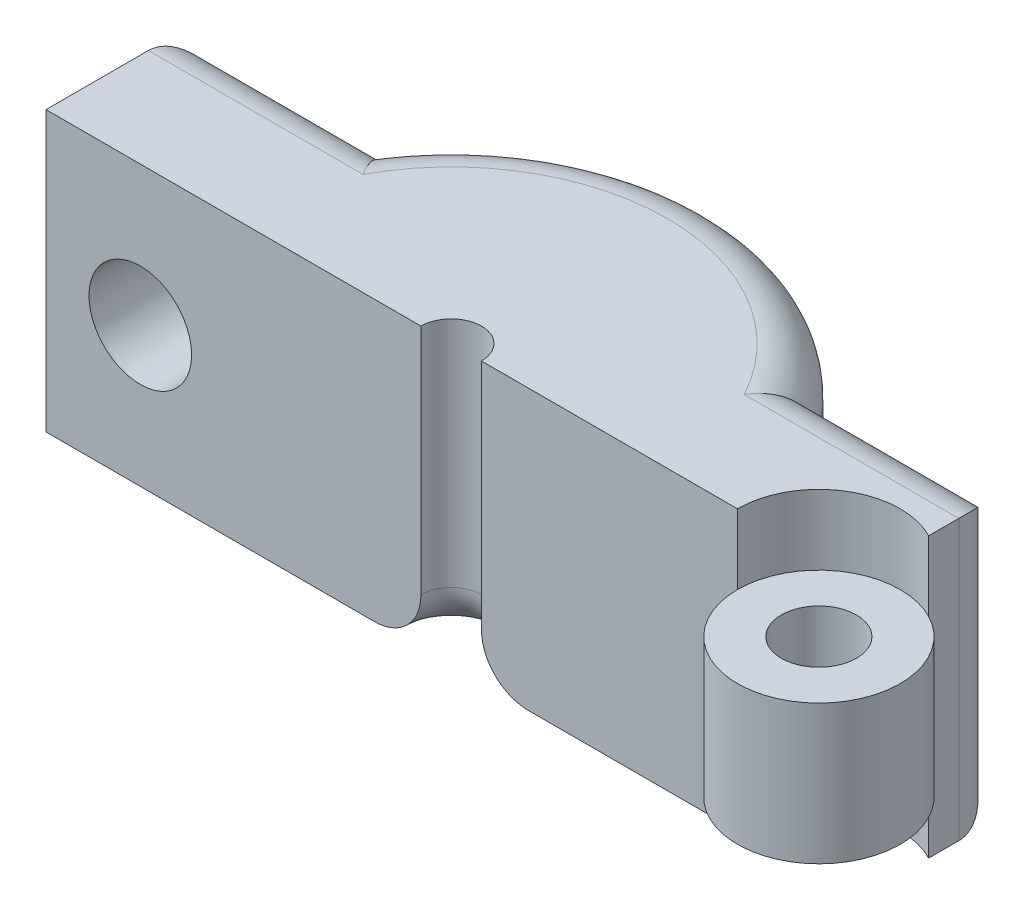
ISO-10303-21;
HEADER;
FILE_DESCRIPTION(('STEP AP214'),'2;1');
FILE_NAME('part.step','',(''),(''),'','','');
FILE_SCHEMA(('AUTOMOTIVE_DESIGN { 1 0 10303 214 1 1 1 1 }'));
ENDSEC;
DATA;
#1=APPLICATION_CONTEXT('core data for automotive mechanical design processes');
#2=APPLICATION_PROTOCOL_DEFINITION('international standard','automotive_design',2000,#1);
#3=PRODUCT_CONTEXT('',#1,'mechanical');
#4=PRODUCT('Part','Part','',(#3));
#5=PRODUCT_RELATED_PRODUCT_CATEGORY('part','',(#4));
#6=PRODUCT_DEFINITION_FORMATION('','',#4);
#7=PRODUCT_DEFINITION_CONTEXT('part definition',#1,'design');
#8=PRODUCT_DEFINITION('design','',#6,#7);
#9=PRODUCT_DEFINITION_SHAPE('','',#8);
#10=(LENGTH_UNIT() NAMED_UNIT(*) SI_UNIT(.MILLI.,.METRE.));
#11=(NAMED_UNIT(*) PLANE_ANGLE_UNIT() SI_UNIT($,.RADIAN.));
#12=(NAMED_UNIT(*) SI_UNIT($,.STERADIAN.) SOLID_ANGLE_UNIT());
#13=UNCERTAINTY_MEASURE_WITH_UNIT(LENGTH_MEASURE(1.E-05),#10,'distance_accuracy_value','');
#14=(GEOMETRIC_REPRESENTATION_CONTEXT(3) GLOBAL_UNCERTAINTY_ASSIGNED_CONTEXT((#13)) GLOBAL_UNIT_ASSIGNED_CONTEXT((#10,
#11,#12)) REPRESENTATION_CONTEXT('',''));
#15=CARTESIAN_POINT('',(0.,0.,0.));
#16=DIRECTION('',(0.,0.,1.));
#17=DIRECTION('',(1.,0.,0.));
#18=AXIS2_PLACEMENT_3D('',#15,#16,#17);
#19=CARTESIAN_POINT('',(20.07,3.6195,0.));
#20=DIRECTION('',(0.,1.,0.));
#21=DIRECTION('',(0.,0.,1.));
#22=AXIS2_PLACEMENT_3D('',#19,#20,#21);
#23=CYLINDRICAL_SURFACE('',#22,4.445);
#24=CARTESIAN_POINT('',(20.07,3.82,0.));
#25=DIRECTION('',(0.,1.,0.));
#26=DIRECTION('',(0.,0.,1.));
#27=AXIS2_PLACEMENT_3D('',#24,#25,#26);
#28=CIRCLE('',#27,4.445);
#29=CARTESIAN_POINT('',(22.12,3.82,-3.94404931510751));
#30=VERTEX_POINT('',#29);
#31=CARTESIAN_POINT('',(15.625,3.82,0.));
#32=VERTEX_POINT('',#31);
#33=EDGE_CURVE('E386',#30,#32,#28,.T.);
#34=ORIENTED_EDGE('',*,*,#33,.T.);
#35=DIRECTION('',(0.,-1.,0.));
#36=VECTOR('',#35,1.);
#37=CARTESIAN_POINT('',(15.625,15.24,0.));
#38=LINE('',#37,#36);
#39=CARTESIAN_POINT('',(15.625,0.,0.));
#40=VERTEX_POINT('',#39);
#41=EDGE_CURVE('E170',#32,#40,#38,.T.);
#42=ORIENTED_EDGE('',*,*,#41,.T.);
#43=CARTESIAN_POINT('',(20.07,0.,0.));
#44=DIRECTION('',(0.,1.,0.));
#45=DIRECTION('',(0.,0.,1.));
#46=AXIS2_PLACEMENT_3D('',#43,#44,#45);
#47=CIRCLE('',#46,4.445);
#48=CARTESIAN_POINT('',(22.12,0.,-3.94404931510751));
#49=VERTEX_POINT('',#48);
#50=EDGE_CURVE('E183',#49,#40,#47,.T.);
#51=ORIENTED_EDGE('',*,*,#50,.F.);
#52=DIRECTION('',(0.,-1.,0.));
#53=VECTOR('',#52,1.);
#54=CARTESIAN_POINT('',(22.12,15.24,-3.94404931510751));
#55=LINE('',#54,#53);
#56=EDGE_CURVE('E173',#30,#49,#55,.T.);
#57=ORIENTED_EDGE('',*,*,#56,.F.);
#58=EDGE_LOOP('',(#34,#42,#51,#57));
#59=FACE_BOUND('',#58,.T.);
#60=ADVANCED_FACE('F43',(#59),#23,.F.);
#61=CARTESIAN_POINT('',(0.,15.24,0.));
#62=DIRECTION('',(0.,1.,0.));
#63=DIRECTION('',(0.,0.,1.));
#64=AXIS2_PLACEMENT_3D('',#61,#62,#63);
#65=PLANE('',#64);
#66=CARTESIAN_POINT('',(20.07,15.24,0.));
#67=DIRECTION('',(0.,-1.,0.));
#68=DIRECTION('',(0.,0.,-1.));
#69=AXIS2_PLACEMENT_3D('',#66,#67,#68);
#70=CIRCLE('',#69,4.445);
#71=CARTESIAN_POINT('',(15.625,15.24,0.));
#72=VERTEX_POINT('',#71);
#73=CARTESIAN_POINT('',(22.12,15.24,-3.94404931510751));
#74=VERTEX_POINT('',#73);
#75=EDGE_CURVE('E165',#72,#74,#70,.T.);
#76=ORIENTED_EDGE('',*,*,#75,.T.);
#77=DIRECTION('',(0.,0.,-1.));
#78=VECTOR('',#77,1.);
#79=CARTESIAN_POINT('',(22.12,15.24,-8.128));
#80=LINE('',#79,#78);
#81=CARTESIAN_POINT('',(22.12,15.24,-5.588));
#82=VERTEX_POINT('',#81);
#83=EDGE_CURVE('E177',#74,#82,#80,.T.);
#84=ORIENTED_EDGE('',*,*,#83,.T.);
#85=DIRECTION('',(-1.,0.,0.));
#86=VECTOR('',#85,1.);
#87=CARTESIAN_POINT('',(11.8273757444329,15.24,-5.588));
#88=LINE('',#87,#86);
#89=CARTESIAN_POINT('',(10.4054782206297,15.24,-5.588));
#90=VERTEX_POINT('',#89);
#91=EDGE_CURVE('E275',#82,#90,#88,.T.);
#92=ORIENTED_EDGE('',*,*,#91,.T.);
#93=CARTESIAN_POINT('',(0.,15.24,0.));
#94=DIRECTION('',(0.,1.,0.));
#95=DIRECTION('',(0.,0.,1.));
#96=AXIS2_PLACEMENT_3D('',#93,#94,#95);
#97=CIRCLE('',#96,11.811);
#98=CARTESIAN_POINT('',(-10.4054782206297,15.24,-5.588));
#99=VERTEX_POINT('',#98);
#100=EDGE_CURVE('E272',#90,#99,#97,.T.);
#101=ORIENTED_EDGE('',*,*,#100,.T.);
#102=DIRECTION('',(-1.,0.,0.));
#103=VECTOR('',#102,1.);
#104=CARTESIAN_POINT('',(-22.12,15.24,-5.588));
#105=LINE('',#104,#103);
#106=CARTESIAN_POINT('',(-22.12,15.24,-5.588));
#107=VERTEX_POINT('',#106);
#108=EDGE_CURVE('E278',#99,#107,#105,.T.);
#109=ORIENTED_EDGE('',*,*,#108,.T.);
#110=DIRECTION('',(0.,0.,1.));
#111=VECTOR('',#110,1.);
#112=CARTESIAN_POINT('',(-22.12,15.24,-8.128));
#113=LINE('',#112,#111);
#114=CARTESIAN_POINT('',(-22.12,15.24,0.));
#115=VERTEX_POINT('',#114);
#116=EDGE_CURVE('E213',#107,#115,#113,.T.);
#117=ORIENTED_EDGE('',*,*,#116,.T.);
#118=DIRECTION('',(1.,0.,0.));
#119=VECTOR('',#118,1.);
#120=CARTESIAN_POINT('',(-22.12,15.24,0.));
#121=LINE('',#120,#119);
#122=CARTESIAN_POINT('',(-1.651,15.24,0.));
#123=VERTEX_POINT('',#122);
#124=EDGE_CURVE('E415',#115,#123,#121,.T.);
#125=ORIENTED_EDGE('',*,*,#124,.T.);
#126=CARTESIAN_POINT('',(0.,15.24,0.));
#127=DIRECTION('',(0.,-1.,0.));
#128=DIRECTION('',(0.,0.,1.));
#129=AXIS2_PLACEMENT_3D('',#126,#127,#128);
#130=CIRCLE('',#129,1.651);
#131=CARTESIAN_POINT('',(1.651,15.24,0.));
#132=VERTEX_POINT('',#131);
#133=EDGE_CURVE('E196',#123,#132,#130,.T.);
#134=ORIENTED_EDGE('',*,*,#133,.T.);
#135=DIRECTION('',(1.,0.,0.));
#136=VECTOR('',#135,1.);
#137=CARTESIAN_POINT('',(15.625,15.24,0.));
#138=LINE('',#137,#136);
#139=EDGE_CURVE('E180',#132,#72,#138,.T.);
#140=ORIENTED_EDGE('',*,*,#139,.T.);
#141=EDGE_LOOP('',(#76,#84,#92,#101,#109,#117,#125,#134,#140));
#142=FACE_BOUND('',#141,.T.);
#143=ADVANCED_FACE('F176',(#142),#65,.T.);
#144=CARTESIAN_POINT('',(0.,0.,0.));
#145=DIRECTION('',(0.,1.,0.));
#146=DIRECTION('',(0.,0.,1.));
#147=AXIS2_PLACEMENT_3D('',#144,#145,#146);
#148=PLANE('',#147);
#149=DIRECTION('',(0.,0.,-1.));
#150=VECTOR('',#149,1.);
#151=CARTESIAN_POINT('',(22.12,0.,-8.128));
#152=LINE('',#151,#150);
#153=CARTESIAN_POINT('',(22.12,0.,-5.588));
#154=VERTEX_POINT('',#153);
#155=EDGE_CURVE('E211',#49,#154,#152,.T.);
#156=ORIENTED_EDGE('',*,*,#155,.F.);
#157=ORIENTED_EDGE('',*,*,#50,.T.);
#158=DIRECTION('',(1.,0.,0.));
#159=VECTOR('',#158,1.);
#160=CARTESIAN_POINT('',(15.625,0.,0.));
#161=LINE('',#160,#159);
#162=CARTESIAN_POINT('',(4.191,0.,0.));
#163=VERTEX_POINT('',#162);
#164=EDGE_CURVE('E207',#163,#40,#161,.T.);
#165=ORIENTED_EDGE('',*,*,#164,.F.);
#166=CARTESIAN_POINT('',(0.,0.,0.));
#167=DIRECTION('',(0.,1.,0.));
#168=DIRECTION('',(0.,0.,1.));
#169=AXIS2_PLACEMENT_3D('',#166,#167,#168);
#170=CIRCLE('',#169,4.191);
#171=CARTESIAN_POINT('',(-4.191,0.,0.));
#172=VERTEX_POINT('',#171);
#173=EDGE_CURVE('E52',#163,#172,#170,.T.);
#174=ORIENTED_EDGE('',*,*,#173,.T.);
#175=DIRECTION('',(1.,0.,0.));
#176=VECTOR('',#175,1.);
#177=CARTESIAN_POINT('',(-22.12,0.,0.));
#178=LINE('',#177,#176);
#179=CARTESIAN_POINT('',(-22.12,0.,0.));
#180=VERTEX_POINT('',#179);
#181=EDGE_CURVE('E203',#180,#172,#178,.T.);
#182=ORIENTED_EDGE('',*,*,#181,.F.);
#183=DIRECTION('',(0.,0.,1.));
#184=VECTOR('',#183,1.);
#185=CARTESIAN_POINT('',(-22.12,0.,-8.128));
#186=LINE('',#185,#184);
#187=CARTESIAN_POINT('',(-22.12,0.,-5.588));
#188=VERTEX_POINT('',#187);
#189=EDGE_CURVE('E200',#188,#180,#186,.T.);
#190=ORIENTED_EDGE('',*,*,#189,.F.);
#191=DIRECTION('',(-1.,0.,0.));
#192=VECTOR('',#191,1.);
#193=CARTESIAN_POINT('',(0.,0.,-5.588));
#194=LINE('',#193,#192);
#195=CARTESIAN_POINT('',(-10.4054782206297,0.,-5.588));
#196=VERTEX_POINT('',#195);
#197=EDGE_CURVE('E241',#188,#196,#194,.F.);
#198=ORIENTED_EDGE('',*,*,#197,.T.);
#199=CARTESIAN_POINT('',(0.,0.,0.));
#200=DIRECTION('',(0.,1.,0.));
#201=DIRECTION('',(0.,0.,1.));
#202=AXIS2_PLACEMENT_3D('',#199,#200,#201);
#203=CIRCLE('',#202,11.811);
#204=CARTESIAN_POINT('',(10.4054782206297,0.,-5.588));
#205=VERTEX_POINT('',#204);
#206=EDGE_CURVE('E244',#196,#205,#203,.F.);
#207=ORIENTED_EDGE('',*,*,#206,.T.);
#208=DIRECTION('',(-1.,0.,0.));
#209=VECTOR('',#208,1.);
#210=CARTESIAN_POINT('',(0.,0.,-5.588));
#211=LINE('',#210,#209);
#212=EDGE_CURVE('E248',#205,#154,#211,.F.);
#213=ORIENTED_EDGE('',*,*,#212,.T.);
#214=EDGE_LOOP('',(#156,#157,#165,#174,#182,#190,#198,#207,#213));
#215=FACE_BOUND('',#214,.T.);
#216=ADVANCED_FACE('F312',(#215),#148,.F.);
#217=CARTESIAN_POINT('',(0.,15.24,0.));
#218=DIRECTION('',(0.,-1.,0.));
#219=DIRECTION('',(0.,0.,-1.));
#220=AXIS2_PLACEMENT_3D('',#217,#218,#219);
#221=CYLINDRICAL_SURFACE('',#220,14.351);
#222=DIRECTION('',(0.,-1.,0.));
#223=VECTOR('',#222,1.);
#224=CARTESIAN_POINT('',(11.8273757444329,15.24,-8.128));
#225=LINE('',#224,#223);
#226=CARTESIAN_POINT('',(11.8273757444329,12.7,-8.128));
#227=VERTEX_POINT('',#226);
#228=CARTESIAN_POINT('',(11.8273757444329,2.54,-8.128));
#229=VERTEX_POINT('',#228);
#230=EDGE_CURVE('E190',#227,#229,#225,.T.);
#231=ORIENTED_EDGE('',*,*,#230,.T.);
#232=CARTESIAN_POINT('',(0.,2.54,0.));
#233=DIRECTION('',(0.,1.,0.));
#234=DIRECTION('',(0.,0.,1.));
#235=AXIS2_PLACEMENT_3D('',#232,#233,#234);
#236=CIRCLE('',#235,14.351);
#237=CARTESIAN_POINT('',(-11.8273757444329,2.54,-8.128));
#238=VERTEX_POINT('',#237);
#239=EDGE_CURVE('E237',#229,#238,#236,.T.);
#240=ORIENTED_EDGE('',*,*,#239,.T.);
#241=DIRECTION('',(0.,-1.,0.));
#242=VECTOR('',#241,1.);
#243=CARTESIAN_POINT('',(-11.8273757444329,15.24,-8.128));
#244=LINE('',#243,#242);
#245=CARTESIAN_POINT('',(-11.8273757444329,12.7,-8.128));
#246=VERTEX_POINT('',#245);
#247=EDGE_CURVE('E230',#246,#238,#244,.T.);
#248=ORIENTED_EDGE('',*,*,#247,.F.);
#249=CARTESIAN_POINT('',(0.,12.7,0.));
#250=DIRECTION('',(0.,1.,0.));
#251=DIRECTION('',(0.,0.,1.));
#252=AXIS2_PLACEMENT_3D('',#249,#250,#251);
#253=CIRCLE('',#252,14.351);
#254=EDGE_CURVE('E234',#246,#227,#253,.F.);
#255=ORIENTED_EDGE('',*,*,#254,.T.);
#256=EDGE_LOOP('',(#231,#240,#248,#255));
#257=FACE_BOUND('',#256,.T.);
#258=ADVANCED_FACE('F315',(#257),#221,.T.);
#259=CARTESIAN_POINT('',(-11.8273757444329,15.24,-8.128));
#260=DIRECTION('',(0.,0.,1.));
#261=DIRECTION('',(1.,0.,0.));
#262=AXIS2_PLACEMENT_3D('',#259,#260,#261);
#263=PLANE('',#262);
#264=ORIENTED_EDGE('',*,*,#247,.T.);
#265=DIRECTION('',(-1.,0.,0.));
#266=VECTOR('',#265,1.);
#267=CARTESIAN_POINT('',(-11.8273757444329,2.54,-8.128));
#268=LINE('',#267,#266);
#269=CARTESIAN_POINT('',(-19.58,2.54,-8.128));
#270=VERTEX_POINT('',#269);
#271=EDGE_CURVE('E269',#238,#270,#268,.T.);
#272=ORIENTED_EDGE('',*,*,#271,.T.);
#273=DIRECTION('',(0.,-1.,0.));
#274=VECTOR('',#273,1.);
#275=CARTESIAN_POINT('',(-19.58,15.24,-8.128));
#276=LINE('',#275,#274);
#277=CARTESIAN_POINT('',(-19.58,6.59670283271748,-8.128));
#278=VERTEX_POINT('',#277);
#279=EDGE_CURVE('E266',#270,#278,#276,.F.);
#280=ORIENTED_EDGE('',*,*,#279,.T.);
#281=CARTESIAN_POINT('',(-16.9736878722165,7.62,-8.128));
#282=DIRECTION('',(0.,0.,-1.));
#283=DIRECTION('',(-1.,0.,0.));
#284=AXIS2_PLACEMENT_3D('',#281,#282,#283);
#285=CIRCLE('',#284,2.8);
#286=CARTESIAN_POINT('',(-19.58,8.64329716728252,-8.128));
#287=VERTEX_POINT('',#286);
#288=EDGE_CURVE('E401',#287,#278,#285,.T.);
#289=ORIENTED_EDGE('',*,*,#288,.F.);
#290=DIRECTION('',(0.,-1.,0.));
#291=VECTOR('',#290,1.);
#292=CARTESIAN_POINT('',(-19.58,15.24,-8.128));
#293=LINE('',#292,#291);
#294=CARTESIAN_POINT('',(-19.58,12.7,-8.128));
#295=VERTEX_POINT('',#294);
#296=EDGE_CURVE('E260',#287,#295,#293,.F.);
#297=ORIENTED_EDGE('',*,*,#296,.T.);
#298=DIRECTION('',(-1.,0.,0.));
#299=VECTOR('',#298,1.);
#300=CARTESIAN_POINT('',(-11.8273757444329,12.7,-8.128));
#301=LINE('',#300,#299);
#302=EDGE_CURVE('E263',#295,#246,#301,.F.);
#303=ORIENTED_EDGE('',*,*,#302,.T.);
#304=EDGE_LOOP('',(#264,#272,#280,#289,#297,#303));
#305=FACE_BOUND('',#304,.T.);
#306=ADVANCED_FACE('F336',(#305),#263,.F.);
#307=CARTESIAN_POINT('',(-22.12,15.24,-8.128));
#308=DIRECTION('',(1.,0.,0.));
#309=DIRECTION('',(0.,0.,-1.));
#310=AXIS2_PLACEMENT_3D('',#307,#308,#309);
#311=PLANE('',#310);
#312=ORIENTED_EDGE('',*,*,#116,.F.);
#313=DIRECTION('',(0.,-1.,0.));
#314=VECTOR('',#313,1.);
#315=CARTESIAN_POINT('',(-22.12,15.24,-5.588));
#316=LINE('',#315,#314);
#317=EDGE_CURVE('E281',#107,#188,#316,.T.);
#318=ORIENTED_EDGE('',*,*,#317,.T.);
#319=ORIENTED_EDGE('',*,*,#189,.T.);
#320=DIRECTION('',(0.,-1.,0.));
#321=VECTOR('',#320,1.);
#322=CARTESIAN_POINT('',(-22.12,15.24,0.));
#323=LINE('',#322,#321);
#324=EDGE_CURVE('E226',#115,#180,#323,.T.);
#325=ORIENTED_EDGE('',*,*,#324,.F.);
#326=EDGE_LOOP('',(#312,#318,#319,#325));
#327=FACE_BOUND('',#326,.T.);
#328=ADVANCED_FACE('F332',(#327),#311,.F.);
#329=CARTESIAN_POINT('',(-22.12,15.24,0.));
#330=DIRECTION('',(0.,0.,-1.));
#331=DIRECTION('',(-1.,0.,0.));
#332=AXIS2_PLACEMENT_3D('',#329,#330,#331);
#333=PLANE('',#332);
#334=CARTESIAN_POINT('',(-16.9736878722165,7.62,0.));
#335=DIRECTION('',(0.,0.,-1.));
#336=DIRECTION('',(-1.,0.,0.));
#337=AXIS2_PLACEMENT_3D('',#334,#335,#336);
#338=CIRCLE('',#337,2.8);
#339=CARTESIAN_POINT('',(-19.7736878722165,7.62,0.));
#340=VERTEX_POINT('',#339);
#341=EDGE_CURVE('E405',#340,#340,#338,.F.);
#342=ORIENTED_EDGE('',*,*,#341,.F.);
#343=EDGE_LOOP('',(#342));
#344=FACE_BOUND('',#343,.T.);
#345=ORIENTED_EDGE('',*,*,#181,.T.);
#346=CARTESIAN_POINT('',(-4.191,2.54,0.));
#347=DIRECTION('',(0.,0.,-1.));
#348=DIRECTION('',(-1.,0.,0.));
#349=AXIS2_PLACEMENT_3D('',#346,#347,#348);
#350=CIRCLE('',#349,2.54);
#351=CARTESIAN_POINT('',(-1.651,2.54000000000001,0.));
#352=VERTEX_POINT('',#351);
#353=EDGE_CURVE('E11',#172,#352,#350,.F.);
#354=ORIENTED_EDGE('',*,*,#353,.T.);
#355=DIRECTION('',(0.,-1.,0.));
#356=VECTOR('',#355,1.);
#357=CARTESIAN_POINT('',(-1.651,15.24,0.));
#358=LINE('',#357,#356);
#359=EDGE_CURVE('E222',#123,#352,#358,.T.);
#360=ORIENTED_EDGE('',*,*,#359,.F.);
#361=ORIENTED_EDGE('',*,*,#124,.F.);
#362=ORIENTED_EDGE('',*,*,#324,.T.);
#363=EDGE_LOOP('',(#345,#354,#360,#361,#362));
#364=FACE_BOUND('',#363,.T.);
#365=ADVANCED_FACE('F328',(#344,#364),#333,.F.);
#366=CARTESIAN_POINT('',(0.,15.24,0.));
#367=DIRECTION('',(0.,-1.,0.));
#368=DIRECTION('',(0.,0.,-1.));
#369=AXIS2_PLACEMENT_3D('',#366,#367,#368);
#370=CYLINDRICAL_SURFACE('',#369,1.651);
#371=ORIENTED_EDGE('',*,*,#359,.T.);
#372=CARTESIAN_POINT('',(0.,2.54,0.));
#373=DIRECTION('',(0.,1.,0.));
#374=DIRECTION('',(0.,0.,1.));
#375=AXIS2_PLACEMENT_3D('',#372,#373,#374);
#376=CIRCLE('',#375,1.651);
#377=CARTESIAN_POINT('',(1.651,2.54000000000001,0.));
#378=VERTEX_POINT('',#377);
#379=EDGE_CURVE('E424',#352,#378,#376,.F.);
#380=ORIENTED_EDGE('',*,*,#379,.T.);
#381=DIRECTION('',(0.,-1.,0.));
#382=VECTOR('',#381,1.);
#383=CARTESIAN_POINT('',(1.651,15.24,0.));
#384=LINE('',#383,#382);
#385=EDGE_CURVE('E218',#132,#378,#384,.T.);
#386=ORIENTED_EDGE('',*,*,#385,.F.);
#387=ORIENTED_EDGE('',*,*,#133,.F.);
#388=EDGE_LOOP('',(#371,#380,#386,#387));
#389=FACE_BOUND('',#388,.T.);
#390=ADVANCED_FACE('F324',(#389),#370,.F.);
#391=CARTESIAN_POINT('',(15.625,15.24,0.));
#392=DIRECTION('',(0.,0.,-1.));
#393=DIRECTION('',(-1.,0.,0.));
#394=AXIS2_PLACEMENT_3D('',#391,#392,#393);
#395=PLANE('',#394);
#396=ORIENTED_EDGE('',*,*,#385,.T.);
#397=CARTESIAN_POINT('',(4.191,2.54,0.));
#398=DIRECTION('',(0.,0.,-1.));
#399=DIRECTION('',(-1.,0.,0.));
#400=AXIS2_PLACEMENT_3D('',#397,#398,#399);
#401=CIRCLE('',#400,2.54);
#402=EDGE_CURVE('E444',#378,#163,#401,.F.);
#403=ORIENTED_EDGE('',*,*,#402,.T.);
#404=ORIENTED_EDGE('',*,*,#164,.T.);
#405=ORIENTED_EDGE('',*,*,#41,.F.);
#406=DIRECTION('',(0.,1.,0.));
#407=VECTOR('',#406,1.);
#408=CARTESIAN_POINT('',(15.625,3.6195,0.));
#409=LINE('',#408,#407);
#410=CARTESIAN_POINT('',(15.625,11.42,0.));
#411=VERTEX_POINT('',#410);
#412=EDGE_CURVE('E204',#32,#411,#409,.T.);
#413=ORIENTED_EDGE('',*,*,#412,.T.);
#414=EDGE_CURVE('E215',#72,#411,#38,.T.);
#415=ORIENTED_EDGE('',*,*,#414,.F.);
#416=ORIENTED_EDGE('',*,*,#139,.F.);
#417=EDGE_LOOP('',(#396,#403,#404,#405,#413,#415,#416));
#418=FACE_BOUND('',#417,.T.);
#419=ADVANCED_FACE('F321',(#418),#395,.F.);
#420=CARTESIAN_POINT('',(22.12,15.24,-8.128));
#421=DIRECTION('',(-1.,0.,0.));
#422=DIRECTION('',(0.,0.,1.));
#423=AXIS2_PLACEMENT_3D('',#420,#421,#422);
#424=PLANE('',#423);
#425=ORIENTED_EDGE('',*,*,#155,.T.);
#426=DIRECTION('',(0.,-1.,0.));
#427=VECTOR('',#426,1.);
#428=CARTESIAN_POINT('',(22.12,15.24,-5.588));
#429=LINE('',#428,#427);
#430=EDGE_CURVE('E188',#154,#82,#429,.F.);
#431=ORIENTED_EDGE('',*,*,#430,.T.);
#432=ORIENTED_EDGE('',*,*,#83,.F.);
#433=CARTESIAN_POINT('',(22.12,11.42,-3.94404931510751));
#434=VERTEX_POINT('',#433);
#435=EDGE_CURVE('E59',#74,#434,#55,.T.);
#436=ORIENTED_EDGE('',*,*,#435,.T.);
#437=EDGE_CURVE('E171',#434,#30,#55,.T.);
#438=ORIENTED_EDGE('',*,*,#437,.T.);
#439=ORIENTED_EDGE('',*,*,#56,.T.);
#440=EDGE_LOOP('',(#425,#431,#432,#436,#438,#439));
#441=FACE_BOUND('',#440,.T.);
#442=ADVANCED_FACE('F186',(#441),#424,.F.);
#443=CARTESIAN_POINT('',(11.8273757444329,15.24,-8.128));
#444=DIRECTION('',(0.,0.,1.));
#445=DIRECTION('',(1.,0.,0.));
#446=AXIS2_PLACEMENT_3D('',#443,#444,#445);
#447=PLANE('',#446);
#448=DIRECTION('',(0.,-1.,0.));
#449=VECTOR('',#448,1.);
#450=CARTESIAN_POINT('',(19.58,15.24,-8.128));
#451=LINE('',#450,#449);
#452=CARTESIAN_POINT('',(19.58,12.7,-8.128));
#453=VERTEX_POINT('',#452);
#454=CARTESIAN_POINT('',(19.58,2.54,-8.128));
#455=VERTEX_POINT('',#454);
#456=EDGE_CURVE('E251',#453,#455,#451,.T.);
#457=ORIENTED_EDGE('',*,*,#456,.T.);
#458=DIRECTION('',(-1.,0.,0.));
#459=VECTOR('',#458,1.);
#460=CARTESIAN_POINT('',(11.8273757444329,2.54,-8.128));
#461=LINE('',#460,#459);
#462=EDGE_CURVE('E257',#455,#229,#461,.T.);
#463=ORIENTED_EDGE('',*,*,#462,.T.);
#464=ORIENTED_EDGE('',*,*,#230,.F.);
#465=DIRECTION('',(-1.,0.,0.));
#466=VECTOR('',#465,1.);
#467=CARTESIAN_POINT('',(22.12,12.7,-8.128));
#468=LINE('',#467,#466);
#469=EDGE_CURVE('E254',#227,#453,#468,.F.);
#470=ORIENTED_EDGE('',*,*,#469,.T.);
#471=EDGE_LOOP('',(#457,#463,#464,#470));
#472=FACE_BOUND('',#471,.T.);
#473=ADVANCED_FACE('F309',(#472),#447,.F.);
#474=ORIENTED_EDGE('',*,*,#414,.T.);
#475=CARTESIAN_POINT('',(20.07,11.42,0.));
#476=DIRECTION('',(0.,1.,0.));
#477=DIRECTION('',(0.,0.,1.));
#478=AXIS2_PLACEMENT_3D('',#475,#476,#477);
#479=CIRCLE('',#478,4.445);
#480=EDGE_CURVE('E168',#434,#411,#479,.T.);
#481=ORIENTED_EDGE('',*,*,#480,.F.);
#482=ORIENTED_EDGE('',*,*,#435,.F.);
#483=ORIENTED_EDGE('',*,*,#75,.F.);
#484=EDGE_LOOP('',(#474,#481,#482,#483));
#485=FACE_BOUND('',#484,.T.);
#486=ADVANCED_FACE('F164',(#485),#23,.F.);
#487=CARTESIAN_POINT('',(-16.9736878722165,7.62,7.91959594928933));
#488=DIRECTION('',(0.,0.,-1.));
#489=DIRECTION('',(-1.,0.,0.));
#490=AXIS2_PLACEMENT_3D('',#487,#488,#489);
#491=CYLINDRICAL_SURFACE('',#490,2.8);
#492=ORIENTED_EDGE('',*,*,#341,.T.);
#493=EDGE_LOOP('',(#492));
#494=FACE_BOUND('',#493,.T.);
#495=ORIENTED_EDGE('',*,*,#288,.T.);
#496=CARTESIAN_POINT('',(-19.58,6.59670283271748,-8.128));
#497=CARTESIAN_POINT('',(-19.608743021435,6.66988816339828,-8.12797740029885));
#498=CARTESIAN_POINT('',(-19.6343866009915,6.74428544409169,-8.12751108385315));
#499=CARTESIAN_POINT('',(-19.6793301267268,6.8949695884192,-8.12616271268799));
#500=CARTESIAN_POINT('',(-19.6986300268663,6.97125646576274,-8.12528065495141));
#501=CARTESIAN_POINT('',(-19.7307584552393,7.12526797329411,-8.12357158311937));
#502=CARTESIAN_POINT('',(-19.7435799343321,7.20299407461001,-8.12274462982823));
#503=CARTESIAN_POINT('',(-19.7626305883625,7.35924792421551,-8.12144422589039));
#504=CARTESIAN_POINT('',(-19.7688602155691,7.43777561713436,-8.12097075099209));
#505=CARTESIAN_POINT('',(-19.7746852932218,7.59513992462262,-8.12052950484983));
#506=CARTESIAN_POINT('',(-19.7742755252101,7.67397673349443,-8.1205621313926));
#507=CARTESIAN_POINT('',(-19.7668119072298,7.83133355929485,-8.12112364361216));
#508=CARTESIAN_POINT('',(-19.7597580999935,7.90985357825771,-8.1216525260972));
#509=CARTESIAN_POINT('',(-19.7390818302719,8.06584025664232,-8.12303443448975));
#510=CARTESIAN_POINT('',(-19.7254739651715,8.14330886542995,-8.12388673917151));
#511=CARTESIAN_POINT('',(-19.69179690153,8.29679419518873,-8.12559448204358));
#512=CARTESIAN_POINT('',(-19.6717314003183,8.37281172066058,-8.12644991816459));
#513=CARTESIAN_POINT('',(-19.6382991759102,8.48083768283848,-8.12735114111492));
#514=CARTESIAN_POINT('',(-19.6274747563794,8.51364930193058,-8.12758205663129));
#515=CARTESIAN_POINT('',(-19.6046311840078,8.57881574723906,-8.1279061800096));
#516=CARTESIAN_POINT('',(-19.5926133043535,8.61117101907304,-8.12799953297445));
#517=CARTESIAN_POINT('',(-19.58,8.64329716728252,-8.128));
#518=B_SPLINE_CURVE_WITH_KNOTS('',3,(#496,#497,#498,#499,#500,#501,#502,#503,#504,#505,#506,
#507,#508,#509,#510,#511,#512,#513,#514,#515,#516,#517),.UNSPECIFIED.,.F.,.F.,(4,2,2,2,2,2,2,2,
2,2,4),(0.,0.235804667044837,0.471611045405561,0.707673454050984,0.943719665329401,
1.17995141412431,1.41618164355948,1.65188815035812,1.88745994241483,1.99109543126376,
2.0946215255047),.UNSPECIFIED.);
#519=EDGE_CURVE('E284',#278,#287,#518,.T.);
#520=ORIENTED_EDGE('',*,*,#519,.T.);
#521=EDGE_LOOP('',(#495,#520));
#522=FACE_BOUND('',#521,.T.);
#523=ADVANCED_FACE('F298',(#494,#522),#491,.F.);
#524=CARTESIAN_POINT('',(0.,12.7,0.));
#525=DIRECTION('',(0.,1.,0.));
#526=DIRECTION('',(0.,0.,1.));
#527=AXIS2_PLACEMENT_3D('',#524,#525,#526);
#528=TOROIDAL_SURFACE('',#527,11.811,2.54);
#529=CARTESIAN_POINT('',(-11.8273757444329,12.7,-8.128));
#530=CARTESIAN_POINT('',(-11.8273803095628,12.7653888705393,-8.12801044582447));
#531=CARTESIAN_POINT('',(-11.8260473037527,12.8307721708373,-8.1254752222906));
#532=CARTESIAN_POINT('',(-11.8207414217647,12.9610264251282,-8.11539337105622));
#533=CARTESIAN_POINT('',(-11.8167692511788,13.0258975113742,-8.10784808281859));
#534=CARTESIAN_POINT('',(-11.8062390830301,13.1544320398614,-8.08786165312935));
#535=CARTESIAN_POINT('',(-11.7996903559203,13.2180989633188,-8.07543806412312));
#536=CARTESIAN_POINT('',(-11.7840793659154,13.3439923029517,-8.04585706248414));
#537=CARTESIAN_POINT('',(-11.7750170277933,13.4062186759542,-8.0286995081743));
#538=CARTESIAN_POINT('',(-11.744191533424,13.5900173192927,-7.97042247790907));
#539=CARTESIAN_POINT('',(-11.718773836011,13.7089023210953,-7.92246797544847));
#540=CARTESIAN_POINT('',(-11.6591205240528,13.9363546582716,-7.81041924602819));
#541=CARTESIAN_POINT('',(-11.6248794962261,14.0449156034625,-7.74631511150228));
#542=CARTESIAN_POINT('',(-11.547044979754,14.2539243222736,-7.60139361641324));
#543=CARTESIAN_POINT('',(-11.5031183180972,14.3538377872781,-7.51998603173957));
#544=CARTESIAN_POINT('',(-11.4081385843597,14.5385441286223,-7.34514239697192));
#545=CARTESIAN_POINT('',(-11.3570837471962,14.6233332479826,-7.25170336809173));
#546=CARTESIAN_POINT('',(-11.243248119315,14.7851781631228,-7.04494020192458));
#547=CARTESIAN_POINT('',(-11.179796389389,14.8604082864335,-6.93055836313374));
#548=CARTESIAN_POINT('',(-11.0472133042207,14.9906631205668,-6.69378053743951));
#549=CARTESIAN_POINT('',(-10.9780764809647,15.0456680936716,-6.57137685852072));
#550=CARTESIAN_POINT('',(-10.8280455168495,15.1401093265343,-6.30842324358422));
#551=CARTESIAN_POINT('',(-10.7466827814375,15.1772692446006,-6.16732744024292));
#552=CARTESIAN_POINT('',(-10.5807609205062,15.2269228435226,-5.88300755964656));
#553=CARTESIAN_POINT('',(-10.4962084834485,15.2394655009266,-5.7397882805676));
#554=CARTESIAN_POINT('',(-10.409152405477,15.2399944356124,-5.59414441154348));
#555=CARTESIAN_POINT('',(-10.4073154629183,15.2400000092924,-5.59107204600717));
#556=CARTESIAN_POINT('',(-10.4054782206297,15.24,-5.588));
#557=B_SPLINE_CURVE_WITH_KNOTS('',3,(#529,#530,#531,#532,#533,#534,#535,#536,#537,#538,#539,
#540,#541,#542,#543,#544,#545,#546,#547,#548,#549,#550,#551,#552,#553,#554,#555,#556),
.UNSPECIFIED.,.F.,.F.,(4,2,2,2,2,2,2,2,2,2,2,2,2,4),(0.,0.196094490989722,0.392136576350674,
0.58747965943443,0.782828589337718,1.17294508992346,1.56330150665617,1.97009938426345,
2.37699817264044,2.82786535200004,3.27917137198302,3.77844871093303,4.27673171634059,
4.28747061381196),.UNSPECIFIED.);
#558=EDGE_CURVE('E460',#99,#246,#557,.F.);
#559=ORIENTED_EDGE('',*,*,#558,.F.);
#560=ORIENTED_EDGE('',*,*,#100,.F.);
#561=CARTESIAN_POINT('',(11.8273757444329,12.7,-8.128));
#562=CARTESIAN_POINT('',(11.8273803095628,12.7653888705393,-8.12801044582447));
#563=CARTESIAN_POINT('',(11.8260473037527,12.8307721708373,-8.1254752222906));
#564=CARTESIAN_POINT('',(11.8207414217647,12.9610264251282,-8.11539337105622));
#565=CARTESIAN_POINT('',(11.8167692511788,13.0258975113742,-8.10784808281859));
#566=CARTESIAN_POINT('',(11.8062390830301,13.1544320398614,-8.08786165312935));
#567=CARTESIAN_POINT('',(11.7996903559203,13.2180989633188,-8.07543806412312));
#568=CARTESIAN_POINT('',(11.7840793659154,13.3439923029517,-8.04585706248414));
#569=CARTESIAN_POINT('',(11.7750170277933,13.4062186759542,-8.0286995081743));
#570=CARTESIAN_POINT('',(11.744191533424,13.5900173192927,-7.97042247790907));
#571=CARTESIAN_POINT('',(11.718773836011,13.7089023210953,-7.92246797544847));
#572=CARTESIAN_POINT('',(11.6591205240528,13.9363546582716,-7.81041924602819));
#573=CARTESIAN_POINT('',(11.6248794962261,14.0449156034625,-7.74631511150228));
#574=CARTESIAN_POINT('',(11.547044979754,14.2539243222736,-7.60139361641324));
#575=CARTESIAN_POINT('',(11.5031183180972,14.3538377872781,-7.51998603173957));
#576=CARTESIAN_POINT('',(11.4081385843597,14.5385441286223,-7.34514239697192));
#577=CARTESIAN_POINT('',(11.3570837471962,14.6233332479826,-7.25170336809173));
#578=CARTESIAN_POINT('',(11.243248119315,14.7851781631228,-7.04494020192458));
#579=CARTESIAN_POINT('',(11.179796389389,14.8604082864335,-6.93055836313374));
#580=CARTESIAN_POINT('',(11.0472133042207,14.9906631205668,-6.69378053743951));
#581=CARTESIAN_POINT('',(10.9780764809647,15.0456680936716,-6.57137685852072));
#582=CARTESIAN_POINT('',(10.8280455168495,15.1401093265343,-6.30842324358422));
#583=CARTESIAN_POINT('',(10.7466827814375,15.1772692446006,-6.16732744024292));
#584=CARTESIAN_POINT('',(10.5807609205062,15.2269228435226,-5.88300755964656));
#585=CARTESIAN_POINT('',(10.4962084834485,15.2394655009266,-5.7397882805676));
#586=CARTESIAN_POINT('',(10.409152405477,15.2399944356124,-5.59414441154348));
#587=CARTESIAN_POINT('',(10.4073154629183,15.2400000092924,-5.59107204600717));
#588=CARTESIAN_POINT('',(10.4054782206297,15.24,-5.588));
#589=B_SPLINE_CURVE_WITH_KNOTS('',3,(#561,#562,#563,#564,#565,#566,#567,#568,#569,#570,#571,
#572,#573,#574,#575,#576,#577,#578,#579,#580,#581,#582,#583,#584,#585,#586,#587,#588),
.UNSPECIFIED.,.F.,.F.,(4,2,2,2,2,2,2,2,2,2,2,2,2,4),(0.,0.196094490989722,0.392136576350674,
0.58747965943443,0.782828589337718,1.17294508992346,1.56330150665617,1.97009938426345,
2.37699817264044,2.82786535200004,3.27917137198302,3.77844871093303,4.27673171634059,
4.28747061381196),.UNSPECIFIED.);
#590=EDGE_CURVE('E406',#227,#90,#589,.T.);
#591=ORIENTED_EDGE('',*,*,#590,.F.);
#592=ORIENTED_EDGE('',*,*,#254,.F.);
#593=EDGE_LOOP('',(#559,#560,#591,#592));
#594=FACE_BOUND('',#593,.T.);
#595=ADVANCED_FACE('F303',(#594),#528,.T.);
#596=CARTESIAN_POINT('',(0.,12.7,-5.588));
#597=DIRECTION('',(1.,0.,0.));
#598=DIRECTION('',(0.,0.,-1.));
#599=AXIS2_PLACEMENT_3D('',#596,#597,#598);
#600=CYLINDRICAL_SURFACE('',#599,2.54);
#601=ORIENTED_EDGE('',*,*,#590,.T.);
#602=ORIENTED_EDGE('',*,*,#91,.F.);
#603=CARTESIAN_POINT('',(19.58,12.7,-5.588));
#604=DIRECTION('',(0.707106781186547,-0.707106781186547,0.));
#605=DIRECTION('',(-0.707106781186547,-0.707106781186547,0.));
#606=AXIS2_PLACEMENT_3D('',#603,#604,#605);
#607=ELLIPSE('',#606,3.59210244842766,2.54);
#608=EDGE_CURVE('E498',#453,#82,#607,.T.);
#609=ORIENTED_EDGE('',*,*,#608,.F.);
#610=ORIENTED_EDGE('',*,*,#469,.F.);
#611=EDGE_LOOP('',(#601,#602,#609,#610));
#612=FACE_BOUND('',#611,.T.);
#613=ADVANCED_FACE('F468',(#612),#600,.T.);
#614=CARTESIAN_POINT('',(0.,12.7,-5.588));
#615=DIRECTION('',(1.,0.,0.));
#616=DIRECTION('',(0.,0.,-1.));
#617=AXIS2_PLACEMENT_3D('',#614,#615,#616);
#618=CYLINDRICAL_SURFACE('',#617,2.54);
#619=ORIENTED_EDGE('',*,*,#558,.T.);
#620=ORIENTED_EDGE('',*,*,#302,.F.);
#621=CARTESIAN_POINT('',(-19.58,12.7,-5.588));
#622=DIRECTION('',(-0.707106781186547,-0.707106781186547,0.));
#623=DIRECTION('',(0.707106781186547,-0.707106781186547,0.));
#624=AXIS2_PLACEMENT_3D('',#621,#622,#623);
#625=ELLIPSE('',#624,3.59210244842766,2.54);
#626=EDGE_CURVE('E495',#107,#295,#625,.T.);
#627=ORIENTED_EDGE('',*,*,#626,.F.);
#628=ORIENTED_EDGE('',*,*,#108,.F.);
#629=EDGE_LOOP('',(#619,#620,#627,#628));
#630=FACE_BOUND('',#629,.T.);
#631=ADVANCED_FACE('F471',(#630),#618,.T.);
#632=CARTESIAN_POINT('',(19.58,15.24,-5.588));
#633=DIRECTION('',(0.,-1.,0.));
#634=DIRECTION('',(0.,0.,-1.));
#635=AXIS2_PLACEMENT_3D('',#632,#633,#634);
#636=CYLINDRICAL_SURFACE('',#635,2.54);
#637=ORIENTED_EDGE('',*,*,#608,.T.);
#638=ORIENTED_EDGE('',*,*,#430,.F.);
#639=CARTESIAN_POINT('',(19.58,2.54,-5.588));
#640=DIRECTION('',(-0.707106781186547,-0.707106781186547,0.));
#641=DIRECTION('',(0.707106781186547,-0.707106781186547,0.));
#642=AXIS2_PLACEMENT_3D('',#639,#640,#641);
#643=ELLIPSE('',#642,3.59210244842766,2.54);
#644=EDGE_CURVE('E499',#455,#154,#643,.T.);
#645=ORIENTED_EDGE('',*,*,#644,.F.);
#646=ORIENTED_EDGE('',*,*,#456,.F.);
#647=EDGE_LOOP('',(#637,#638,#645,#646));
#648=FACE_BOUND('',#647,.T.);
#649=ADVANCED_FACE('F376',(#648),#636,.T.);
#650=CARTESIAN_POINT('',(-19.58,15.24,-5.588));
#651=DIRECTION('',(0.,-1.,0.));
#652=DIRECTION('',(0.,0.,-1.));
#653=AXIS2_PLACEMENT_3D('',#650,#651,#652);
#654=CYLINDRICAL_SURFACE('',#653,2.54);
#655=ORIENTED_EDGE('',*,*,#519,.F.);
#656=ORIENTED_EDGE('',*,*,#279,.F.);
#657=CARTESIAN_POINT('',(-19.58,2.54,-5.588));
#658=DIRECTION('',(0.707106781186547,-0.707106781186547,0.));
#659=DIRECTION('',(-0.707106781186547,-0.707106781186547,0.));
#660=AXIS2_PLACEMENT_3D('',#657,#658,#659);
#661=ELLIPSE('',#660,3.59210244842766,2.54);
#662=EDGE_CURVE('E365',#188,#270,#661,.T.);
#663=ORIENTED_EDGE('',*,*,#662,.F.);
#664=ORIENTED_EDGE('',*,*,#317,.F.);
#665=ORIENTED_EDGE('',*,*,#626,.T.);
#666=ORIENTED_EDGE('',*,*,#296,.F.);
#667=EDGE_LOOP('',(#655,#656,#663,#664,#665,#666));
#668=FACE_BOUND('',#667,.T.);
#669=ADVANCED_FACE('F294',(#668),#654,.T.);
#670=CARTESIAN_POINT('',(11.8273757444329,2.54,-5.588));
#671=DIRECTION('',(-1.,0.,0.));
#672=DIRECTION('',(0.,0.,1.));
#673=AXIS2_PLACEMENT_3D('',#670,#671,#672);
#674=CYLINDRICAL_SURFACE('',#673,2.54);
#675=ORIENTED_EDGE('',*,*,#644,.T.);
#676=ORIENTED_EDGE('',*,*,#212,.F.);
#677=CARTESIAN_POINT('',(11.8273757444329,2.54,-8.128));
#678=CARTESIAN_POINT('',(11.8273803095628,2.47461112946074,-8.12801044582447));
#679=CARTESIAN_POINT('',(11.8260473037527,2.40922782916267,-8.1254752222906));
#680=CARTESIAN_POINT('',(11.8207414217647,2.27897357487177,-8.11539337105622));
#681=CARTESIAN_POINT('',(11.8167692511788,2.21410248862577,-8.10784808281859));
#682=CARTESIAN_POINT('',(11.8062390830301,2.08556796013859,-8.08786165312935));
#683=CARTESIAN_POINT('',(11.7996903559203,2.02190103668119,-8.07543806412312));
#684=CARTESIAN_POINT('',(11.7840793659154,1.89600769704832,-8.04585706248414));
#685=CARTESIAN_POINT('',(11.7750170277933,1.83378132404577,-8.0286995081743));
#686=CARTESIAN_POINT('',(11.744191533424,1.64998268070731,-7.97042247790908));
#687=CARTESIAN_POINT('',(11.718773836011,1.53109767890465,-7.92246797544847));
#688=CARTESIAN_POINT('',(11.6591205240528,1.30364534172845,-7.81041924602819));
#689=CARTESIAN_POINT('',(11.6248794962261,1.19508439653749,-7.74631511150228));
#690=CARTESIAN_POINT('',(11.547044979754,0.986075677726391,-7.60139361641324));
#691=CARTESIAN_POINT('',(11.5031183180972,0.886162212721898,-7.51998603173958));
#692=CARTESIAN_POINT('',(11.4081385843598,0.701455871377673,-7.34514239697192));
#693=CARTESIAN_POINT('',(11.3570837471962,0.616666752017422,-7.25170336809173));
#694=CARTESIAN_POINT('',(11.243248119315,0.454821836877183,-7.04494020192458));
#695=CARTESIAN_POINT('',(11.1797963893891,0.379591713566528,-6.93055836313374));
#696=CARTESIAN_POINT('',(11.0472133042207,0.249336879433155,-6.69378053743951));
#697=CARTESIAN_POINT('',(10.9780764809647,0.194331906328389,-6.57137685852073));
#698=CARTESIAN_POINT('',(10.8280455168495,0.0998906734657011,-6.30842324358422));
#699=CARTESIAN_POINT('',(10.7466827814375,0.0627307553993553,-6.16732744024291));
#700=CARTESIAN_POINT('',(10.5807609205062,0.0130771564773648,-5.88300755964657));
#701=CARTESIAN_POINT('',(10.4962084834485,0.000534499073419271,-5.73978828056762));
#702=CARTESIAN_POINT('',(10.409152405477,5.56438757610507E-06,-5.59414441154348));
#703=CARTESIAN_POINT('',(10.4073154629183,-9.29238905980319E-09,-5.59107204600717));
#704=CARTESIAN_POINT('',(10.4054782206297,0.,-5.588));
#705=B_SPLINE_CURVE_WITH_KNOTS('',3,(#677,#678,#679,#680,#681,#682,#683,#684,#685,#686,#687,
#688,#689,#690,#691,#692,#693,#694,#695,#696,#697,#698,#699,#700,#701,#702,#703,#704),
.UNSPECIFIED.,.F.,.F.,(4,2,2,2,2,2,2,2,2,2,2,2,2,4),(0.,0.196094490989723,0.392136576350673,
0.587479659434429,0.782828589337719,1.17294508992345,1.56330150665617,1.97009938426345,
2.37699817264044,2.82786535200004,3.27917137198302,3.77844871093303,4.27673171634059,
4.28747061381197),.UNSPECIFIED.);
#706=EDGE_CURVE('E358',#229,#205,#705,.T.);
#707=ORIENTED_EDGE('',*,*,#706,.F.);
#708=ORIENTED_EDGE('',*,*,#462,.F.);
#709=EDGE_LOOP('',(#675,#676,#707,#708));
#710=FACE_BOUND('',#709,.T.);
#711=ADVANCED_FACE('F367',(#710),#674,.T.);
#712=CARTESIAN_POINT('',(-11.8273757444329,2.54,-5.588));
#713=DIRECTION('',(-1.,0.,0.));
#714=DIRECTION('',(0.,0.,1.));
#715=AXIS2_PLACEMENT_3D('',#712,#713,#714);
#716=CYLINDRICAL_SURFACE('',#715,2.54);
#717=ORIENTED_EDGE('',*,*,#662,.T.);
#718=ORIENTED_EDGE('',*,*,#271,.F.);
#719=CARTESIAN_POINT('',(-11.8273757444329,2.54,-8.128));
#720=CARTESIAN_POINT('',(-11.8273803095628,2.47461112946074,-8.12801044582447));
#721=CARTESIAN_POINT('',(-11.8260473037527,2.40922782916267,-8.1254752222906));
#722=CARTESIAN_POINT('',(-11.8207414217647,2.27897357487177,-8.11539337105622));
#723=CARTESIAN_POINT('',(-11.8167692511788,2.21410248862577,-8.10784808281859));
#724=CARTESIAN_POINT('',(-11.8062390830301,2.08556796013859,-8.08786165312935));
#725=CARTESIAN_POINT('',(-11.7996903559203,2.02190103668119,-8.07543806412312));
#726=CARTESIAN_POINT('',(-11.7840793659154,1.89600769704832,-8.04585706248414));
#727=CARTESIAN_POINT('',(-11.7750170277933,1.83378132404577,-8.0286995081743));
#728=CARTESIAN_POINT('',(-11.744191533424,1.64998268070731,-7.97042247790908));
#729=CARTESIAN_POINT('',(-11.718773836011,1.53109767890465,-7.92246797544847));
#730=CARTESIAN_POINT('',(-11.6591205240528,1.30364534172845,-7.81041924602819));
#731=CARTESIAN_POINT('',(-11.6248794962261,1.19508439653749,-7.74631511150228));
#732=CARTESIAN_POINT('',(-11.547044979754,0.986075677726391,-7.60139361641324));
#733=CARTESIAN_POINT('',(-11.5031183180972,0.886162212721898,-7.51998603173958));
#734=CARTESIAN_POINT('',(-11.4081385843598,0.701455871377673,-7.34514239697192));
#735=CARTESIAN_POINT('',(-11.3570837471962,0.616666752017422,-7.25170336809173));
#736=CARTESIAN_POINT('',(-11.243248119315,0.454821836877183,-7.04494020192458));
#737=CARTESIAN_POINT('',(-11.1797963893891,0.379591713566528,-6.93055836313374));
#738=CARTESIAN_POINT('',(-11.0472133042207,0.249336879433155,-6.69378053743951));
#739=CARTESIAN_POINT('',(-10.9780764809647,0.194331906328389,-6.57137685852073));
#740=CARTESIAN_POINT('',(-10.8280455168495,0.0998906734657011,-6.30842324358422));
#741=CARTESIAN_POINT('',(-10.7466827814375,0.0627307553993553,-6.16732744024291));
#742=CARTESIAN_POINT('',(-10.5807609205062,0.0130771564773648,-5.88300755964657));
#743=CARTESIAN_POINT('',(-10.4962084834485,0.000534499073419271,-5.73978828056762));
#744=CARTESIAN_POINT('',(-10.409152405477,5.56438757610507E-06,-5.59414441154348));
#745=CARTESIAN_POINT('',(-10.4073154629183,-9.29238905980319E-09,-5.59107204600717));
#746=CARTESIAN_POINT('',(-10.4054782206297,0.,-5.588));
#747=B_SPLINE_CURVE_WITH_KNOTS('',3,(#719,#720,#721,#722,#723,#724,#725,#726,#727,#728,#729,
#730,#731,#732,#733,#734,#735,#736,#737,#738,#739,#740,#741,#742,#743,#744,#745,#746),
.UNSPECIFIED.,.F.,.F.,(4,2,2,2,2,2,2,2,2,2,2,2,2,4),(0.,0.196094490989723,0.392136576350673,
0.587479659434429,0.782828589337719,1.17294508992345,1.56330150665617,1.97009938426345,
2.37699817264044,2.82786535200004,3.27917137198302,3.77844871093303,4.27673171634059,
4.28747061381197),.UNSPECIFIED.);
#748=EDGE_CURVE('E352',#196,#238,#747,.F.);
#749=ORIENTED_EDGE('',*,*,#748,.F.);
#750=ORIENTED_EDGE('',*,*,#197,.F.);
#751=EDGE_LOOP('',(#717,#718,#749,#750));
#752=FACE_BOUND('',#751,.T.);
#753=ADVANCED_FACE('F348',(#752),#716,.T.);
#754=CARTESIAN_POINT('',(0.,2.54,0.));
#755=DIRECTION('',(0.,1.,0.));
#756=DIRECTION('',(0.,0.,1.));
#757=AXIS2_PLACEMENT_3D('',#754,#755,#756);
#758=TOROIDAL_SURFACE('',#757,11.811,2.54);
#759=ORIENTED_EDGE('',*,*,#706,.T.);
#760=ORIENTED_EDGE('',*,*,#206,.F.);
#761=ORIENTED_EDGE('',*,*,#748,.T.);
#762=ORIENTED_EDGE('',*,*,#239,.F.);
#763=EDGE_LOOP('',(#759,#760,#761,#762));
#764=FACE_BOUND('',#763,.T.);
#765=ADVANCED_FACE('F344',(#764),#758,.T.);
#766=CARTESIAN_POINT('',(0.,2.54,0.));
#767=DIRECTION('',(0.,1.,0.));
#768=DIRECTION('',(0.,0.,1.));
#769=AXIS2_PLACEMENT_3D('',#766,#767,#768);
#770=TOROIDAL_SURFACE('',#769,4.191,2.54);
#771=ORIENTED_EDGE('',*,*,#353,.F.);
#772=ORIENTED_EDGE('',*,*,#173,.F.);
#773=ORIENTED_EDGE('',*,*,#402,.F.);
#774=ORIENTED_EDGE('',*,*,#379,.F.);
#775=EDGE_LOOP('',(#771,#772,#773,#774));
#776=FACE_BOUND('',#775,.T.);
#777=ADVANCED_FACE('F45',(#776),#770,.T.);
#778=CARTESIAN_POINT('',(20.07,3.82,0.));
#779=DIRECTION('',(0.,1.,0.));
#780=DIRECTION('',(0.,0.,1.));
#781=AXIS2_PLACEMENT_3D('',#778,#779,#780);
#782=CYLINDRICAL_SURFACE('',#781,4.445);
#783=ORIENTED_EDGE('',*,*,#412,.F.);
#784=EDGE_CURVE('E393',#32,#30,#28,.T.);
#785=ORIENTED_EDGE('',*,*,#784,.T.);
#786=ORIENTED_EDGE('',*,*,#437,.F.);
#787=EDGE_CURVE('E429',#411,#434,#479,.T.);
#788=ORIENTED_EDGE('',*,*,#787,.F.);
#789=EDGE_LOOP('',(#783,#785,#786,#788));
#790=FACE_BOUND('',#789,.T.);
#791=ADVANCED_FACE('F305',(#790),#782,.T.);
#792=CARTESIAN_POINT('',(20.07,3.82,0.));
#793=DIRECTION('',(0.,1.,0.));
#794=DIRECTION('',(0.,0.,1.));
#795=AXIS2_PLACEMENT_3D('',#792,#793,#794);
#796=PLANE('',#795);
#797=CARTESIAN_POINT('',(20.07,3.82,0.));
#798=DIRECTION('',(0.,1.,0.));
#799=DIRECTION('',(0.,0.,1.));
#800=AXIS2_PLACEMENT_3D('',#797,#798,#799);
#801=CIRCLE('',#800,2.05);
#802=CARTESIAN_POINT('',(20.07,3.82,2.05));
#803=VERTEX_POINT('',#802);
#804=EDGE_CURVE('E397',#803,#803,#801,.T.);
#805=ORIENTED_EDGE('',*,*,#804,.T.);
#806=EDGE_LOOP('',(#805));
#807=FACE_BOUND('',#806,.T.);
#808=ORIENTED_EDGE('',*,*,#33,.F.);
#809=ORIENTED_EDGE('',*,*,#784,.F.);
#810=EDGE_LOOP('',(#808,#809));
#811=FACE_BOUND('',#810,.T.);
#812=ADVANCED_FACE('F592',(#807,#811),#796,.F.);
#813=CARTESIAN_POINT('',(20.07,3.82,0.));
#814=DIRECTION('',(0.,1.,0.));
#815=DIRECTION('',(0.,0.,1.));
#816=AXIS2_PLACEMENT_3D('',#813,#814,#815);
#817=CYLINDRICAL_SURFACE('',#816,2.05);
#818=CARTESIAN_POINT('',(20.07,11.42,0.));
#819=DIRECTION('',(0.,1.,0.));
#820=DIRECTION('',(0.,0.,1.));
#821=AXIS2_PLACEMENT_3D('',#818,#819,#820);
#822=CIRCLE('',#821,2.05);
#823=CARTESIAN_POINT('',(20.07,11.42,2.05));
#824=VERTEX_POINT('',#823);
#825=EDGE_CURVE('E432',#824,#824,#822,.T.);
#826=CARTESIAN_POINT('',(20.07,3.82,2.05));
#827=CARTESIAN_POINT('',(20.07,3.89916666666667,2.05));
#828=CARTESIAN_POINT('',(20.07,3.97833333333333,2.05));
#829=CARTESIAN_POINT('',(20.07,4.13666666666666,2.05));
#830=CARTESIAN_POINT('',(20.07,4.21583333333333,2.05));
#831=CARTESIAN_POINT('',(20.07,4.37416666666667,2.05));
#832=CARTESIAN_POINT('',(20.07,4.45333333333333,2.05));
#833=CARTESIAN_POINT('',(20.07,4.61166666666667,2.05));
#834=CARTESIAN_POINT('',(20.07,4.69083333333333,2.05));
#835=CARTESIAN_POINT('',(20.07,4.84916666666667,2.05));
#836=CARTESIAN_POINT('',(20.07,4.92833333333333,2.05));
#837=CARTESIAN_POINT('',(20.07,5.08666666666667,2.05));
#838=CARTESIAN_POINT('',(20.07,5.16583333333333,2.05));
#839=CARTESIAN_POINT('',(20.07,5.32416666666667,2.05));
#840=CARTESIAN_POINT('',(20.07,5.40333333333333,2.05));
#841=CARTESIAN_POINT('',(20.07,5.56166666666667,2.05));
#842=CARTESIAN_POINT('',(20.07,5.64083333333333,2.05));
#843=CARTESIAN_POINT('',(20.07,5.79916666666667,2.05));
#844=CARTESIAN_POINT('',(20.07,5.87833333333333,2.05));
#845=CARTESIAN_POINT('',(20.07,6.03666666666667,2.05));
#846=CARTESIAN_POINT('',(20.07,6.11583333333333,2.05));
#847=CARTESIAN_POINT('',(20.07,6.27416666666667,2.05));
#848=CARTESIAN_POINT('',(20.07,6.35333333333333,2.05));
#849=CARTESIAN_POINT('',(20.07,6.51166666666667,2.05));
#850=CARTESIAN_POINT('',(20.07,6.59083333333333,2.05));
#851=CARTESIAN_POINT('',(20.07,6.74916666666667,2.05));
#852=CARTESIAN_POINT('',(20.07,6.82833333333333,2.05));
#853=CARTESIAN_POINT('',(20.07,6.98666666666667,2.05));
#854=CARTESIAN_POINT('',(20.07,7.06583333333333,2.05));
#855=CARTESIAN_POINT('',(20.07,7.22416666666667,2.05));
#856=CARTESIAN_POINT('',(20.07,7.30333333333333,2.05));
#857=CARTESIAN_POINT('',(20.07,7.46166666666667,2.05));
#858=CARTESIAN_POINT('',(20.07,7.54083333333333,2.05));
#859=CARTESIAN_POINT('',(20.07,7.69916666666666,2.05));
#860=CARTESIAN_POINT('',(20.07,7.77833333333333,2.05));
#861=CARTESIAN_POINT('',(20.07,7.93666666666666,2.05));
#862=CARTESIAN_POINT('',(20.07,8.01583333333333,2.05));
#863=CARTESIAN_POINT('',(20.07,8.17416666666666,2.05));
#864=CARTESIAN_POINT('',(20.07,8.25333333333333,2.05));
#865=CARTESIAN_POINT('',(20.07,8.41166666666667,2.05));
#866=CARTESIAN_POINT('',(20.07,8.49083333333333,2.05));
#867=CARTESIAN_POINT('',(20.07,8.64916666666667,2.05));
#868=CARTESIAN_POINT('',(20.07,8.72833333333333,2.05));
#869=CARTESIAN_POINT('',(20.07,8.88666666666667,2.05));
#870=CARTESIAN_POINT('',(20.07,8.96583333333333,2.05));
#871=CARTESIAN_POINT('',(20.07,9.12416666666667,2.05));
#872=CARTESIAN_POINT('',(20.07,9.20333333333333,2.05));
#873=CARTESIAN_POINT('',(20.07,9.36166666666667,2.05));
#874=CARTESIAN_POINT('',(20.07,9.44083333333333,2.05));
#875=CARTESIAN_POINT('',(20.07,9.59916666666667,2.05));
#876=CARTESIAN_POINT('',(20.07,9.67833333333333,2.05));
#877=CARTESIAN_POINT('',(20.07,9.83666666666667,2.05));
#878=CARTESIAN_POINT('',(20.07,9.91583333333333,2.05));
#879=CARTESIAN_POINT('',(20.07,10.0741666666667,2.05));
#880=CARTESIAN_POINT('',(20.07,10.1533333333333,2.05));
#881=CARTESIAN_POINT('',(20.07,10.3116666666667,2.05));
#882=CARTESIAN_POINT('',(20.07,10.3908333333333,2.05));
#883=CARTESIAN_POINT('',(20.07,10.5491666666667,2.05));
#884=CARTESIAN_POINT('',(20.07,10.6283333333333,2.05));
#885=CARTESIAN_POINT('',(20.07,10.7866666666667,2.05));
#886=CARTESIAN_POINT('',(20.07,10.8658333333333,2.05));
#887=CARTESIAN_POINT('',(20.07,11.0241666666667,2.05));
#888=CARTESIAN_POINT('',(20.07,11.1033333333333,2.05));
#889=CARTESIAN_POINT('',(20.07,11.2616666666667,2.05));
#890=CARTESIAN_POINT('',(20.07,11.3408333333333,2.05));
#891=CARTESIAN_POINT('',(20.07,11.42,2.05));
#892=B_SPLINE_CURVE_WITH_KNOTS('',3,(#826,#827,#828,#829,#830,#831,#832,#833,#834,#835,#836,
#837,#838,#839,#840,#841,#842,#843,#844,#845,#846,#847,#848,#849,#850,#851,#852,#853,#854,#855,
#856,#857,#858,#859,#860,#861,#862,#863,#864,#865,#866,#867,#868,#869,#870,#871,#872,#873,#874,
#875,#876,#877,#878,#879,#880,#881,#882,#883,#884,#885,#886,#887,#888,#889,#890,#891),
.UNSPECIFIED.,.F.,.F.,(4,2,2,2,2,2,2,2,2,2,2,2,2,2,2,2,2,2,2,2,2,2,2,2,2,2,2,2,2,2,2,2,4),(0.,
0.2375,0.475000000000001,0.7125,0.95,1.1875,1.425,1.6625,1.9,2.1375,2.375,2.6125,2.85,3.0875,
3.325,3.5625,3.8,4.0375,4.275,4.5125,4.75,4.9875,5.225,5.4625,5.7,5.9375,6.175,6.4125,6.65,
6.8875,7.125,7.3625,7.6),.UNSPECIFIED.);
#893=EDGE_CURVE('BSEAM601',#803,#824,#892,.T.);
#894=ORIENTED_EDGE('',*,*,#804,.F.);
#895=ORIENTED_EDGE('',*,*,#825,.T.);
#896=ORIENTED_EDGE('',*,*,#893,.T.);
#897=ORIENTED_EDGE('',*,*,#893,.F.);
#898=EDGE_LOOP('',(#894,#896,#895,#897));
#899=FACE_BOUND('',#898,.T.);
#900=ADVANCED_FACE('F601',(#899),#817,.F.);
#901=CARTESIAN_POINT('',(20.07,11.42,0.));
#902=DIRECTION('',(0.,1.,0.));
#903=DIRECTION('',(0.,0.,1.));
#904=AXIS2_PLACEMENT_3D('',#901,#902,#903);
#905=PLANE('',#904);
#906=ORIENTED_EDGE('',*,*,#480,.T.);
#907=ORIENTED_EDGE('',*,*,#787,.T.);
#908=EDGE_LOOP('',(#906,#907));
#909=FACE_BOUND('',#908,.T.);
#910=ORIENTED_EDGE('',*,*,#825,.F.);
#911=EDGE_LOOP('',(#910));
#912=FACE_BOUND('',#911,.T.);
#913=ADVANCED_FACE('F433',(#909,#912),#905,.T.);
#914=CLOSED_SHELL('',(#60,#143,#216,#258,#306,#328,#365,#390,#419,#442,#473,#486,#523,#595,#613,
#631,#649,#669,#711,#753,#765,#777,#791,#812,#900,#913));
#915=MANIFOLD_SOLID_BREP('B2',#914);
#916=ADVANCED_BREP_SHAPE_REPRESENTATION('',(#18,#915),#14);
#917=SHAPE_DEFINITION_REPRESENTATION(#9,#916);
ENDSEC;
END-ISO-10303-21;
